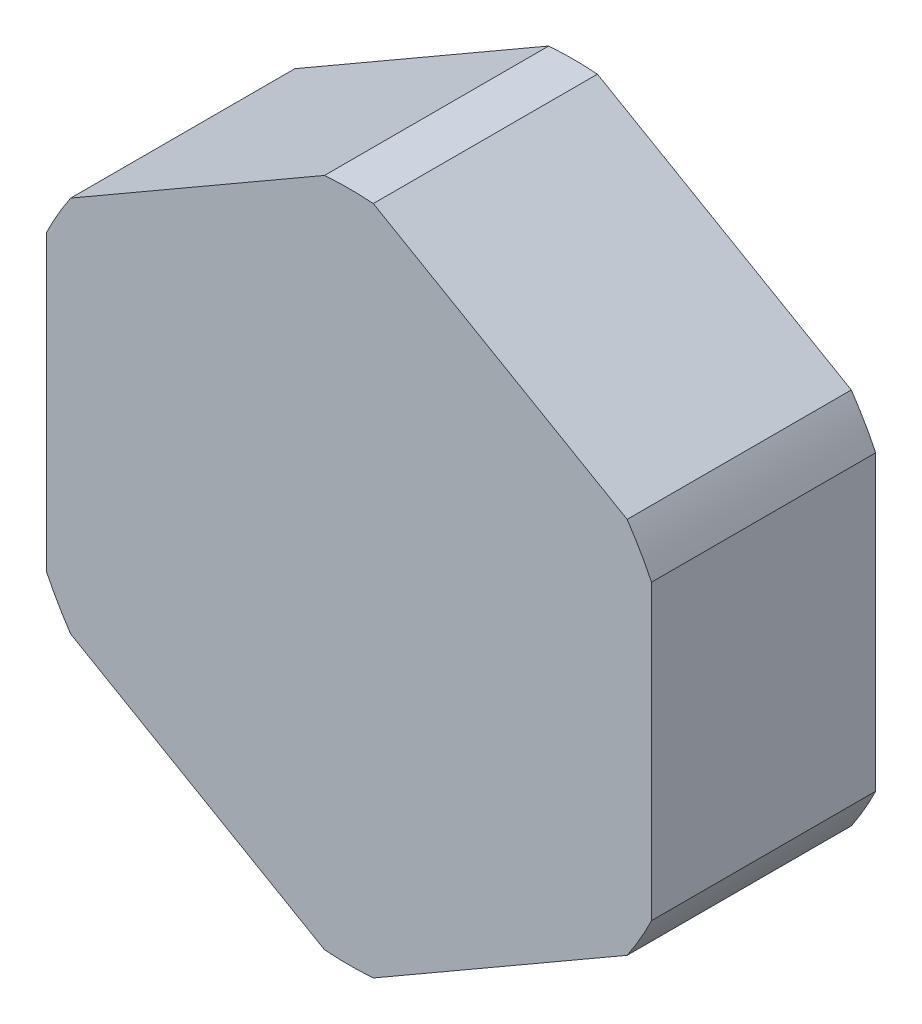
ISO-10303-21;
HEADER;
FILE_DESCRIPTION(('STEP AP214'),'2;1');
FILE_NAME('part.step','',(''),(''),'','','');
FILE_SCHEMA(('AUTOMOTIVE_DESIGN { 1 0 10303 214 1 1 1 1 }'));
ENDSEC;
DATA;
#1=APPLICATION_CONTEXT('core data for automotive mechanical design processes');
#2=APPLICATION_PROTOCOL_DEFINITION('international standard','automotive_design',2000,#1);
#3=PRODUCT_CONTEXT('',#1,'mechanical');
#4=PRODUCT('Part','Part','',(#3));
#5=PRODUCT_RELATED_PRODUCT_CATEGORY('part','',(#4));
#6=PRODUCT_DEFINITION_FORMATION('','',#4);
#7=PRODUCT_DEFINITION_CONTEXT('part definition',#1,'design');
#8=PRODUCT_DEFINITION('design','',#6,#7);
#9=PRODUCT_DEFINITION_SHAPE('','',#8);
#10=(LENGTH_UNIT() NAMED_UNIT(*) SI_UNIT(.MILLI.,.METRE.));
#11=(NAMED_UNIT(*) PLANE_ANGLE_UNIT() SI_UNIT($,.RADIAN.));
#12=(NAMED_UNIT(*) SI_UNIT($,.STERADIAN.) SOLID_ANGLE_UNIT());
#13=UNCERTAINTY_MEASURE_WITH_UNIT(LENGTH_MEASURE(1.E-05),#10,'distance_accuracy_value','');
#14=(GEOMETRIC_REPRESENTATION_CONTEXT(3) GLOBAL_UNCERTAINTY_ASSIGNED_CONTEXT((#13)) GLOBAL_UNIT_ASSIGNED_CONTEXT((#10,
#11,#12)) REPRESENTATION_CONTEXT('',''));
#15=CARTESIAN_POINT('',(0.,0.,0.));
#16=DIRECTION('',(0.,0.,1.));
#17=DIRECTION('',(1.,0.,0.));
#18=AXIS2_PLACEMENT_3D('',#15,#16,#17);
#19=CARTESIAN_POINT('',(13.5,0.,10.));
#20=DIRECTION('',(-1.,0.,0.));
#21=DIRECTION('',(0.,-1.,0.));
#22=AXIS2_PLACEMENT_3D('',#19,#20,#21);
#23=PLANE('',#22);
#24=DIRECTION('',(0.,1.,0.));
#25=VECTOR('',#24,1.);
#26=CARTESIAN_POINT('',(13.5,0.,0.));
#27=LINE('',#26,#25);
#28=CARTESIAN_POINT('',(13.5,-6.53834841531101,0.));
#29=VERTEX_POINT('',#28);
#30=CARTESIAN_POINT('',(13.5,6.53834841531101,0.));
#31=VERTEX_POINT('',#30);
#32=EDGE_CURVE('E158',#29,#31,#27,.T.);
#33=ORIENTED_EDGE('',*,*,#32,.T.);
#34=DIRECTION('',(0.,0.,-1.));
#35=VECTOR('',#34,1.);
#36=CARTESIAN_POINT('',(13.5,6.53834841531101,10.));
#37=LINE('',#36,#35);
#38=CARTESIAN_POINT('',(13.5,6.53834841531101,10.));
#39=VERTEX_POINT('',#38);
#40=EDGE_CURVE('E11',#39,#31,#37,.T.);
#41=ORIENTED_EDGE('',*,*,#40,.F.);
#42=DIRECTION('',(0.,1.,0.));
#43=VECTOR('',#42,1.);
#44=CARTESIAN_POINT('',(13.5,0.,10.));
#45=LINE('',#44,#43);
#46=CARTESIAN_POINT('',(13.5,-6.53834841531101,10.));
#47=VERTEX_POINT('',#46);
#48=EDGE_CURVE('E215',#47,#39,#45,.T.);
#49=ORIENTED_EDGE('',*,*,#48,.F.);
#50=DIRECTION('',(0.,0.,-1.));
#51=VECTOR('',#50,1.);
#52=CARTESIAN_POINT('',(13.5,-6.53834841531101,10.));
#53=LINE('',#52,#51);
#54=EDGE_CURVE('E154',#47,#29,#53,.T.);
#55=ORIENTED_EDGE('',*,*,#54,.T.);
#56=EDGE_LOOP('',(#33,#41,#49,#55));
#57=FACE_BOUND('',#56,.T.);
#58=ADVANCED_FACE('F37',(#57),#23,.F.);
#59=CARTESIAN_POINT('',(0.,0.,10.));
#60=DIRECTION('',(0.,0.,-1.));
#61=DIRECTION('',(-1.,0.,0.));
#62=AXIS2_PLACEMENT_3D('',#59,#60,#61);
#63=CYLINDRICAL_SURFACE('',#62,15.);
#64=CARTESIAN_POINT('',(0.,0.,0.));
#65=DIRECTION('',(0.,0.,1.));
#66=DIRECTION('',(1.,0.,0.));
#67=AXIS2_PLACEMENT_3D('',#64,#65,#66);
#68=CIRCLE('',#67,15.);
#69=CARTESIAN_POINT('',(12.4123758264531,8.42216874343443,0.));
#70=VERTEX_POINT('',#69);
#71=EDGE_CURVE('E161',#31,#70,#68,.T.);
#72=ORIENTED_EDGE('',*,*,#71,.T.);
#73=DIRECTION('',(0.,0.,-1.));
#74=VECTOR('',#73,1.);
#75=CARTESIAN_POINT('',(12.4123758264531,8.42216874343443,10.));
#76=LINE('',#75,#74);
#77=CARTESIAN_POINT('',(12.4123758264531,8.42216874343443,10.));
#78=VERTEX_POINT('',#77);
#79=EDGE_CURVE('E45',#78,#70,#76,.T.);
#80=ORIENTED_EDGE('',*,*,#79,.F.);
#81=CARTESIAN_POINT('',(0.,0.,10.));
#82=DIRECTION('',(0.,0.,1.));
#83=DIRECTION('',(1.,0.,0.));
#84=AXIS2_PLACEMENT_3D('',#81,#82,#83);
#85=CIRCLE('',#84,15.);
#86=EDGE_CURVE('E108',#39,#78,#85,.T.);
#87=ORIENTED_EDGE('',*,*,#86,.F.);
#88=ORIENTED_EDGE('',*,*,#40,.T.);
#89=EDGE_LOOP('',(#72,#80,#87,#88));
#90=FACE_BOUND('',#89,.T.);
#91=ADVANCED_FACE('F247',(#90),#63,.T.);
#92=CARTESIAN_POINT('',(6.75,11.6913429510899,10.));
#93=DIRECTION('',(-0.5,-0.866025403784439,0.));
#94=DIRECTION('',(0.866025403784439,-0.5,0.));
#95=AXIS2_PLACEMENT_3D('',#92,#93,#94);
#96=PLANE('',#95);
#97=DIRECTION('',(-0.866025403784439,0.5,0.));
#98=VECTOR('',#97,1.);
#99=CARTESIAN_POINT('',(6.75,11.6913429510899,0.));
#100=LINE('',#99,#98);
#101=CARTESIAN_POINT('',(1.08762417354695,14.9605171587454,0.));
#102=VERTEX_POINT('',#101);
#103=EDGE_CURVE('E163',#70,#102,#100,.T.);
#104=ORIENTED_EDGE('',*,*,#103,.T.);
#105=DIRECTION('',(0.,0.,-1.));
#106=VECTOR('',#105,1.);
#107=CARTESIAN_POINT('',(1.08762417354695,14.9605171587454,10.));
#108=LINE('',#107,#106);
#109=CARTESIAN_POINT('',(1.08762417354695,14.9605171587454,10.));
#110=VERTEX_POINT('',#109);
#111=EDGE_CURVE('E193',#110,#102,#108,.T.);
#112=ORIENTED_EDGE('',*,*,#111,.F.);
#113=DIRECTION('',(-0.866025403784439,0.5,0.));
#114=VECTOR('',#113,1.);
#115=CARTESIAN_POINT('',(6.75,11.6913429510899,10.));
#116=LINE('',#115,#114);
#117=EDGE_CURVE('E201',#78,#110,#116,.T.);
#118=ORIENTED_EDGE('',*,*,#117,.F.);
#119=ORIENTED_EDGE('',*,*,#79,.T.);
#120=EDGE_LOOP('',(#104,#112,#118,#119));
#121=FACE_BOUND('',#120,.T.);
#122=ADVANCED_FACE('F199',(#121),#96,.F.);
#123=CARTESIAN_POINT('',(-1.08762417354695,14.9605171587454,0.));
#124=VERTEX_POINT('',#123);
#125=EDGE_CURVE('E164',#102,#124,#68,.T.);
#126=ORIENTED_EDGE('',*,*,#125,.T.);
#127=DIRECTION('',(0.,0.,-1.));
#128=VECTOR('',#127,1.);
#129=CARTESIAN_POINT('',(-1.08762417354695,14.9605171587454,10.));
#130=LINE('',#129,#128);
#131=CARTESIAN_POINT('',(-1.08762417354695,14.9605171587454,10.));
#132=VERTEX_POINT('',#131);
#133=EDGE_CURVE('E190',#132,#124,#130,.T.);
#134=ORIENTED_EDGE('',*,*,#133,.F.);
#135=EDGE_CURVE('E219',#110,#132,#85,.T.);
#136=ORIENTED_EDGE('',*,*,#135,.F.);
#137=ORIENTED_EDGE('',*,*,#111,.T.);
#138=EDGE_LOOP('',(#126,#134,#136,#137));
#139=FACE_BOUND('',#138,.T.);
#140=ADVANCED_FACE('F231',(#139),#63,.T.);
#141=CARTESIAN_POINT('',(-6.75,11.6913429510899,10.));
#142=DIRECTION('',(0.5,-0.866025403784439,0.));
#143=DIRECTION('',(0.866025403784439,0.5,0.));
#144=AXIS2_PLACEMENT_3D('',#141,#142,#143);
#145=PLANE('',#144);
#146=DIRECTION('',(-0.866025403784439,-0.5,0.));
#147=VECTOR('',#146,1.);
#148=CARTESIAN_POINT('',(-6.75,11.6913429510899,0.));
#149=LINE('',#148,#147);
#150=CARTESIAN_POINT('',(-12.4123758264531,8.42216874343443,0.));
#151=VERTEX_POINT('',#150);
#152=EDGE_CURVE('E166',#124,#151,#149,.T.);
#153=ORIENTED_EDGE('',*,*,#152,.T.);
#154=DIRECTION('',(0.,0.,-1.));
#155=VECTOR('',#154,1.);
#156=CARTESIAN_POINT('',(-12.4123758264531,8.42216874343443,10.));
#157=LINE('',#156,#155);
#158=CARTESIAN_POINT('',(-12.4123758264531,8.42216874343443,10.));
#159=VERTEX_POINT('',#158);
#160=EDGE_CURVE('E187',#159,#151,#157,.T.);
#161=ORIENTED_EDGE('',*,*,#160,.F.);
#162=DIRECTION('',(-0.866025403784439,-0.5,0.));
#163=VECTOR('',#162,1.);
#164=CARTESIAN_POINT('',(-6.75,11.6913429510899,10.));
#165=LINE('',#164,#163);
#166=EDGE_CURVE('E222',#132,#159,#165,.T.);
#167=ORIENTED_EDGE('',*,*,#166,.F.);
#168=ORIENTED_EDGE('',*,*,#133,.T.);
#169=EDGE_LOOP('',(#153,#161,#167,#168));
#170=FACE_BOUND('',#169,.T.);
#171=ADVANCED_FACE('F233',(#170),#145,.F.);
#172=CARTESIAN_POINT('',(-13.5,6.53834841531101,0.));
#173=VERTEX_POINT('',#172);
#174=EDGE_CURVE('E168',#151,#173,#68,.T.);
#175=ORIENTED_EDGE('',*,*,#174,.T.);
#176=DIRECTION('',(0.,0.,-1.));
#177=VECTOR('',#176,1.);
#178=CARTESIAN_POINT('',(-13.5,6.53834841531101,10.));
#179=LINE('',#178,#177);
#180=CARTESIAN_POINT('',(-13.5,6.53834841531101,10.));
#181=VERTEX_POINT('',#180);
#182=EDGE_CURVE('E184',#181,#173,#179,.T.);
#183=ORIENTED_EDGE('',*,*,#182,.F.);
#184=EDGE_CURVE('E223',#159,#181,#85,.T.);
#185=ORIENTED_EDGE('',*,*,#184,.F.);
#186=ORIENTED_EDGE('',*,*,#160,.T.);
#187=EDGE_LOOP('',(#175,#183,#185,#186));
#188=FACE_BOUND('',#187,.T.);
#189=ADVANCED_FACE('F234',(#188),#63,.T.);
#190=CARTESIAN_POINT('',(-13.5,0.,10.));
#191=DIRECTION('',(1.,0.,0.));
#192=DIRECTION('',(0.,0.,-1.));
#193=AXIS2_PLACEMENT_3D('',#190,#191,#192);
#194=PLANE('',#193);
#195=DIRECTION('',(0.,-1.,0.));
#196=VECTOR('',#195,1.);
#197=CARTESIAN_POINT('',(-13.5,0.,0.));
#198=LINE('',#197,#196);
#199=CARTESIAN_POINT('',(-13.5,-6.53834841531101,0.));
#200=VERTEX_POINT('',#199);
#201=EDGE_CURVE('E169',#173,#200,#198,.T.);
#202=ORIENTED_EDGE('',*,*,#201,.T.);
#203=DIRECTION('',(0.,0.,-1.));
#204=VECTOR('',#203,1.);
#205=CARTESIAN_POINT('',(-13.5,-6.53834841531101,10.));
#206=LINE('',#205,#204);
#207=CARTESIAN_POINT('',(-13.5,-6.53834841531101,10.));
#208=VERTEX_POINT('',#207);
#209=EDGE_CURVE('E181',#208,#200,#206,.T.);
#210=ORIENTED_EDGE('',*,*,#209,.F.);
#211=DIRECTION('',(0.,-1.,0.));
#212=VECTOR('',#211,1.);
#213=CARTESIAN_POINT('',(-13.5,0.,10.));
#214=LINE('',#213,#212);
#215=EDGE_CURVE('E224',#181,#208,#214,.T.);
#216=ORIENTED_EDGE('',*,*,#215,.F.);
#217=ORIENTED_EDGE('',*,*,#182,.T.);
#218=EDGE_LOOP('',(#202,#210,#216,#217));
#219=FACE_BOUND('',#218,.T.);
#220=ADVANCED_FACE('F237',(#219),#194,.F.);
#221=CARTESIAN_POINT('',(-12.4123758264531,-8.42216874343443,0.));
#222=VERTEX_POINT('',#221);
#223=EDGE_CURVE('E171',#200,#222,#68,.T.);
#224=ORIENTED_EDGE('',*,*,#223,.T.);
#225=DIRECTION('',(0.,0.,-1.));
#226=VECTOR('',#225,1.);
#227=CARTESIAN_POINT('',(-12.4123758264531,-8.42216874343443,10.));
#228=LINE('',#227,#226);
#229=CARTESIAN_POINT('',(-12.4123758264531,-8.42216874343443,10.));
#230=VERTEX_POINT('',#229);
#231=EDGE_CURVE('E178',#230,#222,#228,.T.);
#232=ORIENTED_EDGE('',*,*,#231,.F.);
#233=EDGE_CURVE('E144',#208,#230,#85,.T.);
#234=ORIENTED_EDGE('',*,*,#233,.F.);
#235=ORIENTED_EDGE('',*,*,#209,.T.);
#236=EDGE_LOOP('',(#224,#232,#234,#235));
#237=FACE_BOUND('',#236,.T.);
#238=ADVANCED_FACE('F239',(#237),#63,.T.);
#239=CARTESIAN_POINT('',(-6.75,-11.6913429510899,10.));
#240=DIRECTION('',(0.5,0.866025403784439,0.));
#241=DIRECTION('',(-0.866025403784439,0.5,0.));
#242=AXIS2_PLACEMENT_3D('',#239,#240,#241);
#243=PLANE('',#242);
#244=DIRECTION('',(0.866025403784439,-0.5,0.));
#245=VECTOR('',#244,1.);
#246=CARTESIAN_POINT('',(-6.75,-11.6913429510899,0.));
#247=LINE('',#246,#245);
#248=CARTESIAN_POINT('',(-1.08762417354696,-14.9605171587454,0.));
#249=VERTEX_POINT('',#248);
#250=EDGE_CURVE('E172',#222,#249,#247,.T.);
#251=ORIENTED_EDGE('',*,*,#250,.T.);
#252=DIRECTION('',(0.,0.,-1.));
#253=VECTOR('',#252,1.);
#254=CARTESIAN_POINT('',(-1.08762417354696,-14.9605171587454,10.));
#255=LINE('',#254,#253);
#256=CARTESIAN_POINT('',(-1.08762417354696,-14.9605171587454,10.));
#257=VERTEX_POINT('',#256);
#258=EDGE_CURVE('E149',#257,#249,#255,.T.);
#259=ORIENTED_EDGE('',*,*,#258,.F.);
#260=DIRECTION('',(0.866025403784439,-0.5,0.));
#261=VECTOR('',#260,1.);
#262=CARTESIAN_POINT('',(-6.75,-11.6913429510899,10.));
#263=LINE('',#262,#261);
#264=EDGE_CURVE('E139',#230,#257,#263,.T.);
#265=ORIENTED_EDGE('',*,*,#264,.F.);
#266=ORIENTED_EDGE('',*,*,#231,.T.);
#267=EDGE_LOOP('',(#251,#259,#265,#266));
#268=FACE_BOUND('',#267,.T.);
#269=ADVANCED_FACE('F242',(#268),#243,.F.);
#270=CARTESIAN_POINT('',(1.08762417354694,-14.9605171587454,0.));
#271=VERTEX_POINT('',#270);
#272=EDGE_CURVE('E148',#249,#271,#68,.T.);
#273=ORIENTED_EDGE('',*,*,#272,.T.);
#274=DIRECTION('',(0.,0.,-1.));
#275=VECTOR('',#274,1.);
#276=CARTESIAN_POINT('',(1.08762417354694,-14.9605171587454,10.));
#277=LINE('',#276,#275);
#278=CARTESIAN_POINT('',(1.08762417354694,-14.9605171587454,10.));
#279=VERTEX_POINT('',#278);
#280=EDGE_CURVE('E145',#279,#271,#277,.T.);
#281=ORIENTED_EDGE('',*,*,#280,.F.);
#282=EDGE_CURVE('E133',#257,#279,#85,.T.);
#283=ORIENTED_EDGE('',*,*,#282,.F.);
#284=ORIENTED_EDGE('',*,*,#258,.T.);
#285=EDGE_LOOP('',(#273,#281,#283,#284));
#286=FACE_BOUND('',#285,.T.);
#287=ADVANCED_FACE('F146',(#286),#63,.T.);
#288=CARTESIAN_POINT('',(6.75,-11.6913429510899,10.));
#289=DIRECTION('',(-0.5,0.866025403784439,0.));
#290=DIRECTION('',(-0.866025403784439,-0.5,0.));
#291=AXIS2_PLACEMENT_3D('',#288,#289,#290);
#292=PLANE('',#291);
#293=DIRECTION('',(0.866025403784439,0.5,0.));
#294=VECTOR('',#293,1.);
#295=CARTESIAN_POINT('',(6.75,-11.6913429510899,0.));
#296=LINE('',#295,#294);
#297=CARTESIAN_POINT('',(12.4123758264531,-8.42216874343443,0.));
#298=VERTEX_POINT('',#297);
#299=EDGE_CURVE('E94',#271,#298,#296,.T.);
#300=ORIENTED_EDGE('',*,*,#299,.T.);
#301=DIRECTION('',(0.,0.,-1.));
#302=VECTOR('',#301,1.);
#303=CARTESIAN_POINT('',(12.4123758264531,-8.42216874343443,10.));
#304=LINE('',#303,#302);
#305=CARTESIAN_POINT('',(12.4123758264531,-8.42216874343443,10.));
#306=VERTEX_POINT('',#305);
#307=EDGE_CURVE('E150',#306,#298,#304,.T.);
#308=ORIENTED_EDGE('',*,*,#307,.F.);
#309=DIRECTION('',(0.866025403784439,0.5,0.));
#310=VECTOR('',#309,1.);
#311=CARTESIAN_POINT('',(6.75,-11.6913429510899,10.));
#312=LINE('',#311,#310);
#313=EDGE_CURVE('E137',#279,#306,#312,.T.);
#314=ORIENTED_EDGE('',*,*,#313,.F.);
#315=ORIENTED_EDGE('',*,*,#280,.T.);
#316=EDGE_LOOP('',(#300,#308,#314,#315));
#317=FACE_BOUND('',#316,.T.);
#318=ADVANCED_FACE('F152',(#317),#292,.F.);
#319=EDGE_CURVE('E100',#298,#29,#68,.T.);
#320=ORIENTED_EDGE('',*,*,#319,.T.);
#321=ORIENTED_EDGE('',*,*,#54,.F.);
#322=EDGE_CURVE('E53',#306,#47,#85,.T.);
#323=ORIENTED_EDGE('',*,*,#322,.F.);
#324=ORIENTED_EDGE('',*,*,#307,.T.);
#325=EDGE_LOOP('',(#320,#321,#323,#324));
#326=FACE_BOUND('',#325,.T.);
#327=ADVANCED_FACE('F244',(#326),#63,.T.);
#328=CARTESIAN_POINT('',(0.,0.,10.));
#329=DIRECTION('',(0.,0.,1.));
#330=DIRECTION('',(1.,0.,0.));
#331=AXIS2_PLACEMENT_3D('',#328,#329,#330);
#332=PLANE('',#331);
#333=ORIENTED_EDGE('',*,*,#48,.T.);
#334=ORIENTED_EDGE('',*,*,#86,.T.);
#335=ORIENTED_EDGE('',*,*,#117,.T.);
#336=ORIENTED_EDGE('',*,*,#135,.T.);
#337=ORIENTED_EDGE('',*,*,#166,.T.);
#338=ORIENTED_EDGE('',*,*,#184,.T.);
#339=ORIENTED_EDGE('',*,*,#215,.T.);
#340=ORIENTED_EDGE('',*,*,#233,.T.);
#341=ORIENTED_EDGE('',*,*,#264,.T.);
#342=ORIENTED_EDGE('',*,*,#282,.T.);
#343=ORIENTED_EDGE('',*,*,#313,.T.);
#344=ORIENTED_EDGE('',*,*,#322,.T.);
#345=EDGE_LOOP('',(#333,#334,#335,#336,#337,#338,#339,#340,#341,#342,#343,#344));
#346=FACE_BOUND('',#345,.T.);
#347=ADVANCED_FACE('F135',(#346),#332,.T.);
#348=CARTESIAN_POINT('',(0.,0.,0.));
#349=DIRECTION('',(0.,0.,1.));
#350=DIRECTION('',(1.,0.,0.));
#351=AXIS2_PLACEMENT_3D('',#348,#349,#350);
#352=PLANE('',#351);
#353=ORIENTED_EDGE('',*,*,#32,.F.);
#354=ORIENTED_EDGE('',*,*,#319,.F.);
#355=ORIENTED_EDGE('',*,*,#299,.F.);
#356=ORIENTED_EDGE('',*,*,#272,.F.);
#357=ORIENTED_EDGE('',*,*,#250,.F.);
#358=ORIENTED_EDGE('',*,*,#223,.F.);
#359=ORIENTED_EDGE('',*,*,#201,.F.);
#360=ORIENTED_EDGE('',*,*,#174,.F.);
#361=ORIENTED_EDGE('',*,*,#152,.F.);
#362=ORIENTED_EDGE('',*,*,#125,.F.);
#363=ORIENTED_EDGE('',*,*,#103,.F.);
#364=ORIENTED_EDGE('',*,*,#71,.F.);
#365=EDGE_LOOP('',(#353,#354,#355,#356,#357,#358,#359,#360,#361,#362,#363,#364));
#366=FACE_BOUND('',#365,.T.);
#367=ADVANCED_FACE('F205',(#366),#352,.F.);
#368=CLOSED_SHELL('',(#58,#91,#122,#140,#171,#189,#220,#238,#269,#287,#318,#327,#347,#367));
#369=MANIFOLD_SOLID_BREP('B2',#368);
#370=ADVANCED_BREP_SHAPE_REPRESENTATION('',(#18,#369),#14);
#371=SHAPE_DEFINITION_REPRESENTATION(#9,#370);
ENDSEC;
END-ISO-10303-21;
